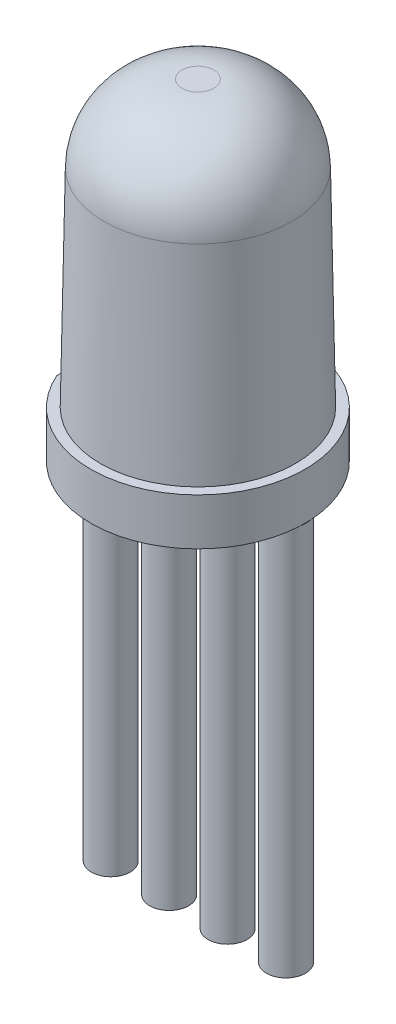
ISO-10303-21;
HEADER;
FILE_DESCRIPTION(('STEP AP214'),'2;1');
FILE_NAME('part.step','',(''),(''),'','','');
FILE_SCHEMA(('AUTOMOTIVE_DESIGN { 1 0 10303 214 1 1 1 1 }'));
ENDSEC;
DATA;
#1=APPLICATION_CONTEXT('core data for automotive mechanical design processes');
#2=APPLICATION_PROTOCOL_DEFINITION('international standard','automotive_design',2000,#1);
#3=PRODUCT_CONTEXT('',#1,'mechanical');
#4=PRODUCT('Part','Part','',(#3));
#5=PRODUCT_RELATED_PRODUCT_CATEGORY('part','',(#4));
#6=PRODUCT_DEFINITION_FORMATION('','',#4);
#7=PRODUCT_DEFINITION_CONTEXT('part definition',#1,'design');
#8=PRODUCT_DEFINITION('design','',#6,#7);
#9=PRODUCT_DEFINITION_SHAPE('','',#8);
#10=(LENGTH_UNIT() NAMED_UNIT(*) SI_UNIT(.MILLI.,.METRE.));
#11=(NAMED_UNIT(*) PLANE_ANGLE_UNIT() SI_UNIT($,.RADIAN.));
#12=(NAMED_UNIT(*) SI_UNIT($,.STERADIAN.) SOLID_ANGLE_UNIT());
#13=UNCERTAINTY_MEASURE_WITH_UNIT(LENGTH_MEASURE(1.E-05),#10,'distance_accuracy_value','');
#14=(GEOMETRIC_REPRESENTATION_CONTEXT(3) GLOBAL_UNCERTAINTY_ASSIGNED_CONTEXT((#13)) GLOBAL_UNIT_ASSIGNED_CONTEXT((#10,
#11,#12)) REPRESENTATION_CONTEXT('',''));
#15=CARTESIAN_POINT('',(0.,0.,0.));
#16=DIRECTION('',(0.,0.,1.));
#17=DIRECTION('',(1.,0.,0.));
#18=AXIS2_PLACEMENT_3D('',#15,#16,#17);
#19=CARTESIAN_POINT('',(0.,0.,0.));
#20=DIRECTION('',(0.,-1.,0.));
#21=DIRECTION('',(0.,0.,-1.));
#22=AXIS2_PLACEMENT_3D('',#19,#20,#21);
#23=PLANE('',#22);
#24=CARTESIAN_POINT('',(-2.2380791975749,0.,0.));
#25=DIRECTION('',(0.,-1.,0.));
#26=DIRECTION('',(0.,0.,-1.));
#27=AXIS2_PLACEMENT_3D('',#24,#25,#26);
#28=CIRCLE('',#27,0.5);
#29=CARTESIAN_POINT('',(-2.2380791975749,0.,-0.5));
#30=VERTEX_POINT('',#29);
#31=EDGE_CURVE('E12',#30,#30,#28,.T.);
#32=ORIENTED_EDGE('',*,*,#31,.F.);
#33=EDGE_LOOP('',(#32));
#34=FACE_BOUND('',#33,.T.);
#35=ADVANCED_FACE('F88',(#34),#23,.F.);
#36=CARTESIAN_POINT('',(-2.2380791975749,-10.,0.));
#37=DIRECTION('',(0.,1.,0.));
#38=DIRECTION('',(0.,0.,1.));
#39=AXIS2_PLACEMENT_3D('',#36,#37,#38);
#40=CYLINDRICAL_SURFACE('',#39,0.5);
#41=ORIENTED_EDGE('',*,*,#31,.T.);
#42=EDGE_LOOP('',(#41));
#43=FACE_BOUND('',#42,.T.);
#44=CARTESIAN_POINT('',(-2.2380791975749,-10.,0.));
#45=DIRECTION('',(0.,-1.,0.));
#46=DIRECTION('',(0.,0.,-1.));
#47=AXIS2_PLACEMENT_3D('',#44,#45,#46);
#48=CIRCLE('',#47,0.5);
#49=CARTESIAN_POINT('',(-2.2380791975749,-10.,-0.5));
#50=VERTEX_POINT('',#49);
#51=EDGE_CURVE('E92',#50,#50,#48,.T.);
#52=ORIENTED_EDGE('',*,*,#51,.F.);
#53=EDGE_LOOP('',(#52));
#54=FACE_BOUND('',#53,.T.);
#55=ADVANCED_FACE('F102',(#43,#54),#40,.T.);
#56=CARTESIAN_POINT('',(0.,-10.,0.));
#57=DIRECTION('',(0.,-1.,0.));
#58=DIRECTION('',(0.,0.,-1.));
#59=AXIS2_PLACEMENT_3D('',#56,#57,#58);
#60=PLANE('',#59);
#61=ORIENTED_EDGE('',*,*,#51,.T.);
#62=EDGE_LOOP('',(#61));
#63=FACE_BOUND('',#62,.T.);
#64=ADVANCED_FACE('F90',(#63),#60,.T.);
#65=CLOSED_SHELL('',(#35,#55,#64));
#66=MANIFOLD_SOLID_BREP('B2',#65);
#67=CARTESIAN_POINT('',(0.,0.,0.));
#68=DIRECTION('',(0.,-1.,0.));
#69=DIRECTION('',(0.,0.,-1.));
#70=AXIS2_PLACEMENT_3D('',#67,#68,#69);
#71=PLANE('',#70);
#72=CARTESIAN_POINT('',(0.761920802425095,0.,0.));
#73=DIRECTION('',(0.,-1.,0.));
#74=DIRECTION('',(0.,0.,-1.));
#75=AXIS2_PLACEMENT_3D('',#72,#73,#74);
#76=CIRCLE('',#75,0.5);
#77=CARTESIAN_POINT('',(0.761920802425095,0.,-0.5));
#78=VERTEX_POINT('',#77);
#79=EDGE_CURVE('E87',#78,#78,#76,.T.);
#80=ORIENTED_EDGE('',*,*,#79,.F.);
#81=EDGE_LOOP('',(#80));
#82=FACE_BOUND('',#81,.T.);
#83=ADVANCED_FACE('F146',(#82),#71,.F.);
#84=CARTESIAN_POINT('',(0.761920802425095,-10.,0.));
#85=DIRECTION('',(0.,1.,0.));
#86=DIRECTION('',(0.,0.,1.));
#87=AXIS2_PLACEMENT_3D('',#84,#85,#86);
#88=CYLINDRICAL_SURFACE('',#87,0.5);
#89=ORIENTED_EDGE('',*,*,#79,.T.);
#90=EDGE_LOOP('',(#89));
#91=FACE_BOUND('',#90,.T.);
#92=CARTESIAN_POINT('',(0.761920802425095,-10.,0.));
#93=DIRECTION('',(0.,-1.,0.));
#94=DIRECTION('',(0.,0.,-1.));
#95=AXIS2_PLACEMENT_3D('',#92,#93,#94);
#96=CIRCLE('',#95,0.5);
#97=CARTESIAN_POINT('',(0.761920802425095,-10.,-0.5));
#98=VERTEX_POINT('',#97);
#99=EDGE_CURVE('E150',#98,#98,#96,.T.);
#100=ORIENTED_EDGE('',*,*,#99,.F.);
#101=EDGE_LOOP('',(#100));
#102=FACE_BOUND('',#101,.T.);
#103=ADVANCED_FACE('F160',(#91,#102),#88,.T.);
#104=CARTESIAN_POINT('',(0.,-10.,0.));
#105=DIRECTION('',(0.,-1.,0.));
#106=DIRECTION('',(0.,0.,-1.));
#107=AXIS2_PLACEMENT_3D('',#104,#105,#106);
#108=PLANE('',#107);
#109=ORIENTED_EDGE('',*,*,#99,.T.);
#110=EDGE_LOOP('',(#109));
#111=FACE_BOUND('',#110,.T.);
#112=ADVANCED_FACE('F148',(#111),#108,.T.);
#113=CLOSED_SHELL('',(#83,#103,#112));
#114=MANIFOLD_SOLID_BREP('B7',#113);
#115=CARTESIAN_POINT('',(0.,0.,0.));
#116=DIRECTION('',(0.,-1.,0.));
#117=DIRECTION('',(0.,0.,-1.));
#118=AXIS2_PLACEMENT_3D('',#115,#116,#117);
#119=PLANE('',#118);
#120=CARTESIAN_POINT('',(2.2619208024251,0.,0.));
#121=DIRECTION('',(0.,-1.,0.));
#122=DIRECTION('',(0.,0.,-1.));
#123=AXIS2_PLACEMENT_3D('',#120,#121,#122);
#124=CIRCLE('',#123,0.5);
#125=CARTESIAN_POINT('',(2.2619208024251,0.,-0.5));
#126=VERTEX_POINT('',#125);
#127=EDGE_CURVE('E145',#126,#126,#124,.T.);
#128=ORIENTED_EDGE('',*,*,#127,.F.);
#129=EDGE_LOOP('',(#128));
#130=FACE_BOUND('',#129,.T.);
#131=ADVANCED_FACE('F204',(#130),#119,.F.);
#132=CARTESIAN_POINT('',(2.2619208024251,-10.,0.));
#133=DIRECTION('',(0.,1.,0.));
#134=DIRECTION('',(0.,0.,1.));
#135=AXIS2_PLACEMENT_3D('',#132,#133,#134);
#136=CYLINDRICAL_SURFACE('',#135,0.5);
#137=ORIENTED_EDGE('',*,*,#127,.T.);
#138=EDGE_LOOP('',(#137));
#139=FACE_BOUND('',#138,.T.);
#140=CARTESIAN_POINT('',(2.2619208024251,-10.,0.));
#141=DIRECTION('',(0.,-1.,0.));
#142=DIRECTION('',(0.,0.,-1.));
#143=AXIS2_PLACEMENT_3D('',#140,#141,#142);
#144=CIRCLE('',#143,0.5);
#145=CARTESIAN_POINT('',(2.2619208024251,-10.,-0.5));
#146=VERTEX_POINT('',#145);
#147=EDGE_CURVE('E208',#146,#146,#144,.T.);
#148=ORIENTED_EDGE('',*,*,#147,.F.);
#149=EDGE_LOOP('',(#148));
#150=FACE_BOUND('',#149,.T.);
#151=ADVANCED_FACE('F218',(#139,#150),#136,.T.);
#152=CARTESIAN_POINT('',(0.,-10.,0.));
#153=DIRECTION('',(0.,-1.,0.));
#154=DIRECTION('',(0.,0.,-1.));
#155=AXIS2_PLACEMENT_3D('',#152,#153,#154);
#156=PLANE('',#155);
#157=ORIENTED_EDGE('',*,*,#147,.T.);
#158=EDGE_LOOP('',(#157));
#159=FACE_BOUND('',#158,.T.);
#160=ADVANCED_FACE('F206',(#159),#156,.T.);
#161=CLOSED_SHELL('',(#131,#151,#160));
#162=MANIFOLD_SOLID_BREP('B82',#161);
#163=CARTESIAN_POINT('',(0.,0.,0.));
#164=DIRECTION('',(0.,-1.,0.));
#165=DIRECTION('',(0.,0.,-1.));
#166=AXIS2_PLACEMENT_3D('',#163,#164,#165);
#167=PLANE('',#166);
#168=CARTESIAN_POINT('',(-0.738079197574905,0.,0.));
#169=DIRECTION('',(0.,-1.,0.));
#170=DIRECTION('',(0.,0.,-1.));
#171=AXIS2_PLACEMENT_3D('',#168,#169,#170);
#172=CIRCLE('',#171,0.5);
#173=CARTESIAN_POINT('',(-0.738079197574905,0.,-0.5));
#174=VERTEX_POINT('',#173);
#175=EDGE_CURVE('E267',#174,#174,#172,.T.);
#176=ORIENTED_EDGE('',*,*,#175,.F.);
#177=EDGE_LOOP('',(#176));
#178=FACE_BOUND('',#177,.T.);
#179=ADVANCED_FACE('F263',(#178),#167,.F.);
#180=CARTESIAN_POINT('',(-0.738079197574905,-10.,0.));
#181=DIRECTION('',(0.,1.,0.));
#182=DIRECTION('',(0.,0.,1.));
#183=AXIS2_PLACEMENT_3D('',#180,#181,#182);
#184=CYLINDRICAL_SURFACE('',#183,0.5);
#185=ORIENTED_EDGE('',*,*,#175,.T.);
#186=EDGE_LOOP('',(#185));
#187=FACE_BOUND('',#186,.T.);
#188=CARTESIAN_POINT('',(-0.738079197574905,-10.,0.));
#189=DIRECTION('',(0.,-1.,0.));
#190=DIRECTION('',(0.,0.,-1.));
#191=AXIS2_PLACEMENT_3D('',#188,#189,#190);
#192=CIRCLE('',#191,0.5);
#193=CARTESIAN_POINT('',(-0.738079197574905,-10.,-0.5));
#194=VERTEX_POINT('',#193);
#195=EDGE_CURVE('E203',#194,#194,#192,.T.);
#196=ORIENTED_EDGE('',*,*,#195,.F.);
#197=EDGE_LOOP('',(#196));
#198=FACE_BOUND('',#197,.T.);
#199=ADVANCED_FACE('F265',(#187,#198),#184,.T.);
#200=CARTESIAN_POINT('',(0.,-10.,0.));
#201=DIRECTION('',(0.,-1.,0.));
#202=DIRECTION('',(0.,0.,-1.));
#203=AXIS2_PLACEMENT_3D('',#200,#201,#202);
#204=PLANE('',#203);
#205=ORIENTED_EDGE('',*,*,#195,.T.);
#206=EDGE_LOOP('',(#205));
#207=FACE_BOUND('',#206,.T.);
#208=ADVANCED_FACE('F279',(#207),#204,.T.);
#209=CLOSED_SHELL('',(#179,#199,#208));
#210=MANIFOLD_SOLID_BREP('B140',#209);
#211=CARTESIAN_POINT('',(0.,1.2,0.));
#212=DIRECTION('',(0.,-1.,0.));
#213=DIRECTION('',(0.,0.,-1.));
#214=AXIS2_PLACEMENT_3D('',#211,#212,#213);
#215=CYLINDRICAL_SURFACE('',#214,2.75);
#216=CARTESIAN_POINT('',(0.,1.2,0.));
#217=DIRECTION('',(0.,1.,0.));
#218=DIRECTION('',(0.,0.,1.));
#219=AXIS2_PLACEMENT_3D('',#216,#217,#218);
#220=CIRCLE('',#219,2.75);
#221=CARTESIAN_POINT('',(-2.51833212482211,1.2,1.10476391554438));
#222=VERTEX_POINT('',#221);
#223=CARTESIAN_POINT('',(-2.51833212482211,1.2,-1.10476391554439));
#224=VERTEX_POINT('',#223);
#225=EDGE_CURVE('E350',#222,#224,#220,.T.);
#226=ORIENTED_EDGE('',*,*,#225,.F.);
#227=DIRECTION('',(0.,-1.,0.));
#228=VECTOR('',#227,1.);
#229=CARTESIAN_POINT('',(-2.51833212482211,1.2,1.10476391554439));
#230=LINE('',#229,#228);
#231=CARTESIAN_POINT('',(-2.51833212482211,0.,1.10476391554439));
#232=VERTEX_POINT('',#231);
#233=EDGE_CURVE('E335',#222,#232,#230,.T.);
#234=ORIENTED_EDGE('',*,*,#233,.T.);
#235=CARTESIAN_POINT('',(0.,0.,0.));
#236=DIRECTION('',(0.,1.,0.));
#237=DIRECTION('',(0.,0.,1.));
#238=AXIS2_PLACEMENT_3D('',#235,#236,#237);
#239=CIRCLE('',#238,2.75);
#240=CARTESIAN_POINT('',(-2.51833212482211,0.,-1.10476391554439));
#241=VERTEX_POINT('',#240);
#242=EDGE_CURVE('E344',#232,#241,#239,.T.);
#243=ORIENTED_EDGE('',*,*,#242,.T.);
#244=DIRECTION('',(0.,-1.,0.));
#245=VECTOR('',#244,1.);
#246=CARTESIAN_POINT('',(-2.51833212482211,1.2,-1.10476391554439));
#247=LINE('',#246,#245);
#248=EDGE_CURVE('E328',#241,#224,#247,.F.);
#249=ORIENTED_EDGE('',*,*,#248,.T.);
#250=EDGE_LOOP('',(#226,#234,#243,#249));
#251=FACE_BOUND('',#250,.T.);
#252=ADVANCED_FACE('F312',(#251),#215,.T.);
#253=CARTESIAN_POINT('',(0.,1.2,0.));
#254=DIRECTION('',(0.,1.,0.));
#255=DIRECTION('',(0.,0.,1.));
#256=AXIS2_PLACEMENT_3D('',#253,#254,#255);
#257=PLANE('',#256);
#258=DIRECTION('',(0.,0.,-1.));
#259=VECTOR('',#258,1.);
#260=CARTESIAN_POINT('',(-2.51833212482211,1.2,-8.176774608188));
#261=LINE('',#260,#259);
#262=EDGE_CURVE('E338',#222,#224,#261,.T.);
#263=ORIENTED_EDGE('',*,*,#262,.F.);
#264=ORIENTED_EDGE('',*,*,#225,.T.);
#265=EDGE_LOOP('',(#263,#264));
#266=FACE_BOUND('',#265,.T.);
#267=CARTESIAN_POINT('',(0.,1.2,0.));
#268=DIRECTION('',(0.,1.,0.));
#269=DIRECTION('',(0.,0.,1.));
#270=AXIS2_PLACEMENT_3D('',#267,#268,#269);
#271=CIRCLE('',#270,2.5);
#272=CARTESIAN_POINT('',(0.,1.2,2.5));
#273=VERTEX_POINT('',#272);
#274=EDGE_CURVE('E354',#273,#273,#271,.T.);
#275=ORIENTED_EDGE('',*,*,#274,.F.);
#276=EDGE_LOOP('',(#275));
#277=FACE_BOUND('',#276,.T.);
#278=ADVANCED_FACE('F348',(#266,#277),#257,.T.);
#279=CARTESIAN_POINT('',(0.,0.,0.));
#280=DIRECTION('',(0.,1.,0.));
#281=DIRECTION('',(0.,0.,1.));
#282=AXIS2_PLACEMENT_3D('',#279,#280,#281);
#283=PLANE('',#282);
#284=ORIENTED_EDGE('',*,*,#242,.F.);
#285=DIRECTION('',(0.,0.,-1.));
#286=VECTOR('',#285,1.);
#287=CARTESIAN_POINT('',(-2.51833212482211,0.,0.));
#288=LINE('',#287,#286);
#289=EDGE_CURVE('E261',#232,#241,#288,.T.);
#290=ORIENTED_EDGE('',*,*,#289,.T.);
#291=EDGE_LOOP('',(#284,#290));
#292=FACE_BOUND('',#291,.T.);
#293=ADVANCED_FACE('F382',(#292),#283,.F.);
#294=CARTESIAN_POINT('',(0.,1.2,0.));
#295=DIRECTION('',(0.,-1.,0.));
#296=DIRECTION('',(0.,0.,1.));
#297=AXIS2_PLACEMENT_3D('',#294,#295,#296);
#298=CONICAL_SURFACE('',#297,2.5,0.0174532925199433);
#299=CARTESIAN_POINT('',(0.,6.53490481287457,0.));
#300=DIRECTION('',(0.,-1.,0.));
#301=DIRECTION('',(0.,0.,-1.));
#302=AXIS2_PLACEMENT_3D('',#299,#300,#301);
#303=CIRCLE('',#302,2.40687889010541);
#304=CARTESIAN_POINT('',(0.,6.53490481287457,-2.40687889010541));
#305=VERTEX_POINT('',#304);
#306=EDGE_CURVE('E321',#305,#305,#303,.T.);
#307=ORIENTED_EDGE('',*,*,#306,.T.);
#308=EDGE_LOOP('',(#307));
#309=FACE_BOUND('',#308,.T.);
#310=ORIENTED_EDGE('',*,*,#274,.T.);
#311=EDGE_LOOP('',(#310));
#312=FACE_BOUND('',#311,.T.);
#313=ADVANCED_FACE('F369',(#309,#312),#298,.T.);
#314=CARTESIAN_POINT('',(0.,8.5,0.));
#315=DIRECTION('',(0.,1.,0.));
#316=DIRECTION('',(0.,0.,1.));
#317=AXIS2_PLACEMENT_3D('',#314,#315,#316);
#318=PLANE('',#317);
#319=CARTESIAN_POINT('',(0.,8.5,0.));
#320=DIRECTION('',(0.,1.,0.));
#321=DIRECTION('',(0.,0.,1.));
#322=AXIS2_PLACEMENT_3D('',#319,#320,#321);
#323=CIRCLE('',#322,0.407183499792631);
#324=CARTESIAN_POINT('',(0.,8.5,0.407183499792631));
#325=VERTEX_POINT('',#324);
#326=EDGE_CURVE('E359',#325,#325,#323,.T.);
#327=ORIENTED_EDGE('',*,*,#326,.T.);
#328=EDGE_LOOP('',(#327));
#329=FACE_BOUND('',#328,.T.);
#330=ADVANCED_FACE('F374',(#329),#318,.T.);
#331=CARTESIAN_POINT('',(0.,6.5,0.));
#332=DIRECTION('',(0.,1.,0.));
#333=DIRECTION('',(0.,0.,1.));
#334=AXIS2_PLACEMENT_3D('',#331,#332,#333);
#335=DEGENERATE_TOROIDAL_SURFACE('',#334,0.407183499792631,2.,.T.);
#336=ORIENTED_EDGE('',*,*,#306,.F.);
#337=EDGE_LOOP('',(#336));
#338=FACE_BOUND('',#337,.T.);
#339=ORIENTED_EDGE('',*,*,#326,.F.);
#340=EDGE_LOOP('',(#339));
#341=FACE_BOUND('',#340,.T.);
#342=ADVANCED_FACE('F314',(#338,#341),#335,.T.);
#343=CARTESIAN_POINT('',(-2.51833212482211,-6.1,-8.176774608188));
#344=DIRECTION('',(1.,0.,0.));
#345=DIRECTION('',(0.,0.,-1.));
#346=AXIS2_PLACEMENT_3D('',#343,#344,#345);
#347=PLANE('',#346);
#348=ORIENTED_EDGE('',*,*,#262,.T.);
#349=ORIENTED_EDGE('',*,*,#248,.F.);
#350=ORIENTED_EDGE('',*,*,#289,.F.);
#351=ORIENTED_EDGE('',*,*,#233,.F.);
#352=EDGE_LOOP('',(#348,#349,#350,#351));
#353=FACE_BOUND('',#352,.T.);
#354=ADVANCED_FACE('F337',(#353),#347,.F.);
#355=CLOSED_SHELL('',(#252,#278,#293,#313,#330,#342,#354));
#356=MANIFOLD_SOLID_BREP('B198',#355);
#357=ADVANCED_BREP_SHAPE_REPRESENTATION('',(#18,#66,#114,#162,#210,#356),#14);
#358=SHAPE_DEFINITION_REPRESENTATION(#9,#357);
ENDSEC;
END-ISO-10303-21;
